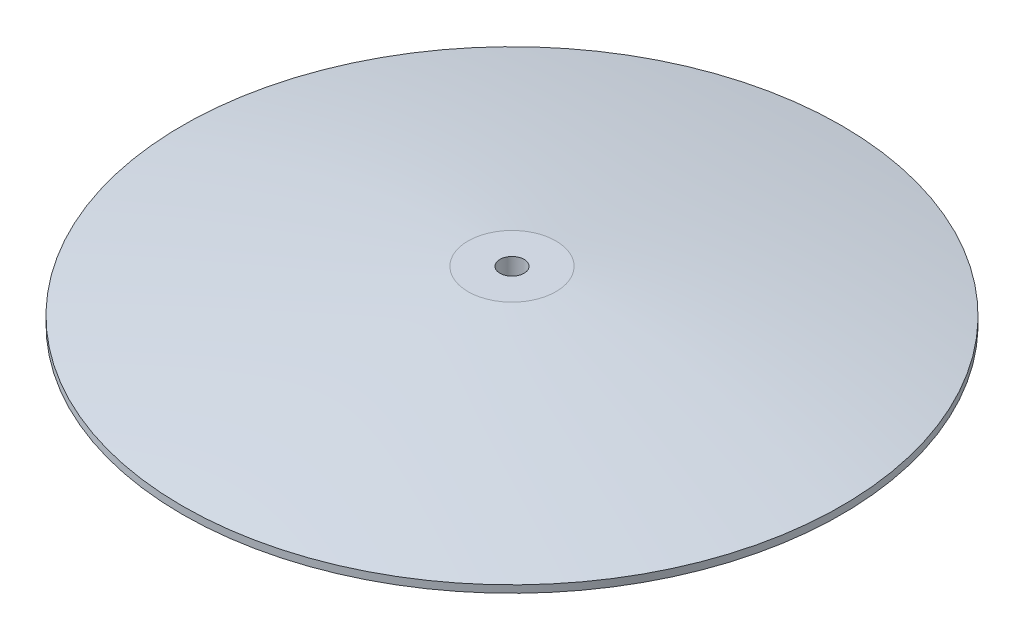
ISO-10303-21;
HEADER;
FILE_DESCRIPTION(('STEP AP214'),'2;1');
FILE_NAME('part.step','',(''),(''),'','','');
FILE_SCHEMA(('AUTOMOTIVE_DESIGN { 1 0 10303 214 1 1 1 1 }'));
ENDSEC;
DATA;
#1=APPLICATION_CONTEXT('core data for automotive mechanical design processes');
#2=APPLICATION_PROTOCOL_DEFINITION('international standard','automotive_design',2000,#1);
#3=PRODUCT_CONTEXT('',#1,'mechanical');
#4=PRODUCT('Part','Part','',(#3));
#5=PRODUCT_RELATED_PRODUCT_CATEGORY('part','',(#4));
#6=PRODUCT_DEFINITION_FORMATION('','',#4);
#7=PRODUCT_DEFINITION_CONTEXT('part definition',#1,'design');
#8=PRODUCT_DEFINITION('design','',#6,#7);
#9=PRODUCT_DEFINITION_SHAPE('','',#8);
#10=(LENGTH_UNIT() NAMED_UNIT(*) SI_UNIT(.MILLI.,.METRE.));
#11=(NAMED_UNIT(*) PLANE_ANGLE_UNIT() SI_UNIT($,.RADIAN.));
#12=(NAMED_UNIT(*) SI_UNIT($,.STERADIAN.) SOLID_ANGLE_UNIT());
#13=UNCERTAINTY_MEASURE_WITH_UNIT(LENGTH_MEASURE(1.E-05),#10,'distance_accuracy_value','');
#14=(GEOMETRIC_REPRESENTATION_CONTEXT(3) GLOBAL_UNCERTAINTY_ASSIGNED_CONTEXT((#13)) GLOBAL_UNIT_ASSIGNED_CONTEXT((#10,
#11,#12)) REPRESENTATION_CONTEXT('',''));
#15=CARTESIAN_POINT('',(0.,0.,0.));
#16=DIRECTION('',(0.,0.,1.));
#17=DIRECTION('',(1.,0.,0.));
#18=AXIS2_PLACEMENT_3D('',#15,#16,#17);
#19=CARTESIAN_POINT('',(0.,7.32433756160729,0.));
#20=CARTESIAN_POINT('',(22.7182623957815,5.73227230955951,0.));
#21=CARTESIAN_POINT('',(45.,1.,0.));
#22=B_SPLINE_CURVE_WITH_KNOTS('',2,(#19,#20,#21),.UNSPECIFIED.,.F.,.F.,(3,3),(0.,1.),.UNSPECIFIED.);
#23=CARTESIAN_POINT('',(0.,7.32433756160729,0.));
#24=DIRECTION('',(0.,1.,0.));
#25=AXIS1_PLACEMENT('',#23,#24);
#26=SURFACE_OF_REVOLUTION('',#22,#25);
#27=CARTESIAN_POINT('',(0.,1.,0.));
#28=DIRECTION('',(0.,1.,0.));
#29=DIRECTION('',(0.,0.,1.));
#30=AXIS2_PLACEMENT_3D('',#27,#28,#29);
#31=CIRCLE('',#30,45.);
#32=CARTESIAN_POINT('',(0.,1.,45.));
#33=VERTEX_POINT('',#32);
#34=EDGE_CURVE('E49',#33,#33,#31,.T.);
#35=ORIENTED_EDGE('',*,*,#34,.T.);
#36=EDGE_LOOP('',(#35));
#37=FACE_BOUND('',#36,.T.);
#38=CARTESIAN_POINT('',(0.,6.84843307665764,0.));
#39=DIRECTION('',(0.,1.,0.));
#40=DIRECTION('',(0.,0.,1.));
#41=AXIS2_PLACEMENT_3D('',#38,#39,#40);
#42=CIRCLE('',#41,6.);
#43=CARTESIAN_POINT('',(0.,6.84843307665764,6.));
#44=VERTEX_POINT('',#43);
#45=EDGE_CURVE('E10',#44,#44,#42,.T.);
#46=ORIENTED_EDGE('',*,*,#45,.F.);
#47=EDGE_LOOP('',(#46));
#48=FACE_BOUND('',#47,.T.);
#49=ADVANCED_FACE('F37',(#37,#48),#26,.F.);
#50=CARTESIAN_POINT('',(0.,6.84843307665764,0.));
#51=DIRECTION('',(0.,1.,0.));
#52=DIRECTION('',(0.,0.,1.));
#53=AXIS2_PLACEMENT_3D('',#50,#51,#52);
#54=PLANE('',#53);
#55=CARTESIAN_POINT('',(0.,6.84843307665764,0.));
#56=DIRECTION('',(0.,1.,0.));
#57=DIRECTION('',(0.,0.,1.));
#58=AXIS2_PLACEMENT_3D('',#55,#56,#57);
#59=CIRCLE('',#58,1.65);
#60=CARTESIAN_POINT('',(0.,6.84843307665764,1.65));
#61=VERTEX_POINT('',#60);
#62=EDGE_CURVE('E80',#61,#61,#59,.T.);
#63=ORIENTED_EDGE('',*,*,#62,.F.);
#64=EDGE_LOOP('',(#63));
#65=FACE_BOUND('',#64,.T.);
#66=ORIENTED_EDGE('',*,*,#45,.T.);
#67=EDGE_LOOP('',(#66));
#68=FACE_BOUND('',#67,.T.);
#69=ADVANCED_FACE('F69',(#65,#68),#54,.T.);
#70=CARTESIAN_POINT('',(0.,3.82433756160729,0.));
#71=CARTESIAN_POINT('',(22.6630536358788,4.04585094431404,0.));
#72=CARTESIAN_POINT('',(45.,0.,0.));
#73=B_SPLINE_CURVE_WITH_KNOTS('',2,(#70,#71,#72),.UNSPECIFIED.,.F.,.F.,(3,3),(0.,1.),.UNSPECIFIED.);
#74=CARTESIAN_POINT('',(0.,7.32433756160729,0.));
#75=DIRECTION('',(0.,1.,0.));
#76=AXIS1_PLACEMENT('',#74,#75);
#77=SURFACE_OF_REVOLUTION('',#73,#76);
#78=CARTESIAN_POINT('',(0.,3.83481128954351,0.));
#79=DIRECTION('',(0.,1.,0.));
#80=DIRECTION('',(0.,0.,1.));
#81=AXIS2_PLACEMENT_3D('',#78,#79,#80);
#82=CIRCLE('',#81,1.65);
#83=CARTESIAN_POINT('',(0.,3.83481128954351,1.65));
#84=VERTEX_POINT('',#83);
#85=EDGE_CURVE('E41',#84,#84,#82,.T.);
#86=ORIENTED_EDGE('',*,*,#85,.T.);
#87=EDGE_LOOP('',(#86));
#88=FACE_BOUND('',#87,.T.);
#89=CARTESIAN_POINT('',(0.,0.,0.));
#90=DIRECTION('',(0.,1.,0.));
#91=DIRECTION('',(0.,0.,1.));
#92=AXIS2_PLACEMENT_3D('',#89,#90,#91);
#93=CIRCLE('',#92,45.);
#94=CARTESIAN_POINT('',(0.,0.,45.));
#95=VERTEX_POINT('',#94);
#96=EDGE_CURVE('E45',#95,#95,#93,.T.);
#97=ORIENTED_EDGE('',*,*,#96,.F.);
#98=EDGE_LOOP('',(#97));
#99=FACE_BOUND('',#98,.T.);
#100=ADVANCED_FACE('F65',(#88,#99),#77,.T.);
#101=CARTESIAN_POINT('',(0.,7.32433756160729,0.));
#102=DIRECTION('',(0.,1.,0.));
#103=DIRECTION('',(0.,0.,1.));
#104=AXIS2_PLACEMENT_3D('',#101,#102,#103);
#105=CYLINDRICAL_SURFACE('',#104,45.);
#106=ORIENTED_EDGE('',*,*,#34,.F.);
#107=EDGE_LOOP('',(#106));
#108=FACE_BOUND('',#107,.T.);
#109=ORIENTED_EDGE('',*,*,#96,.T.);
#110=EDGE_LOOP('',(#109));
#111=FACE_BOUND('',#110,.T.);
#112=ADVANCED_FACE('F68',(#108,#111),#105,.T.);
#113=CARTESIAN_POINT('',(0.,-3.15156692334236,0.));
#114=DIRECTION('',(0.,1.,0.));
#115=DIRECTION('',(0.,0.,1.));
#116=AXIS2_PLACEMENT_3D('',#113,#114,#115);
#117=CYLINDRICAL_SURFACE('',#116,1.65);
#118=ORIENTED_EDGE('',*,*,#62,.T.);
#119=EDGE_LOOP('',(#118));
#120=FACE_BOUND('',#119,.T.);
#121=ORIENTED_EDGE('',*,*,#85,.F.);
#122=EDGE_LOOP('',(#121));
#123=FACE_BOUND('',#122,.T.);
#124=ADVANCED_FACE('F86',(#120,#123),#117,.F.);
#125=CLOSED_SHELL('',(#49,#69,#100,#112,#124));
#126=MANIFOLD_SOLID_BREP('B2',#125);
#127=ADVANCED_BREP_SHAPE_REPRESENTATION('',(#18,#126),#14);
#128=SHAPE_DEFINITION_REPRESENTATION(#9,#127);
ENDSEC;
END-ISO-10303-21;
